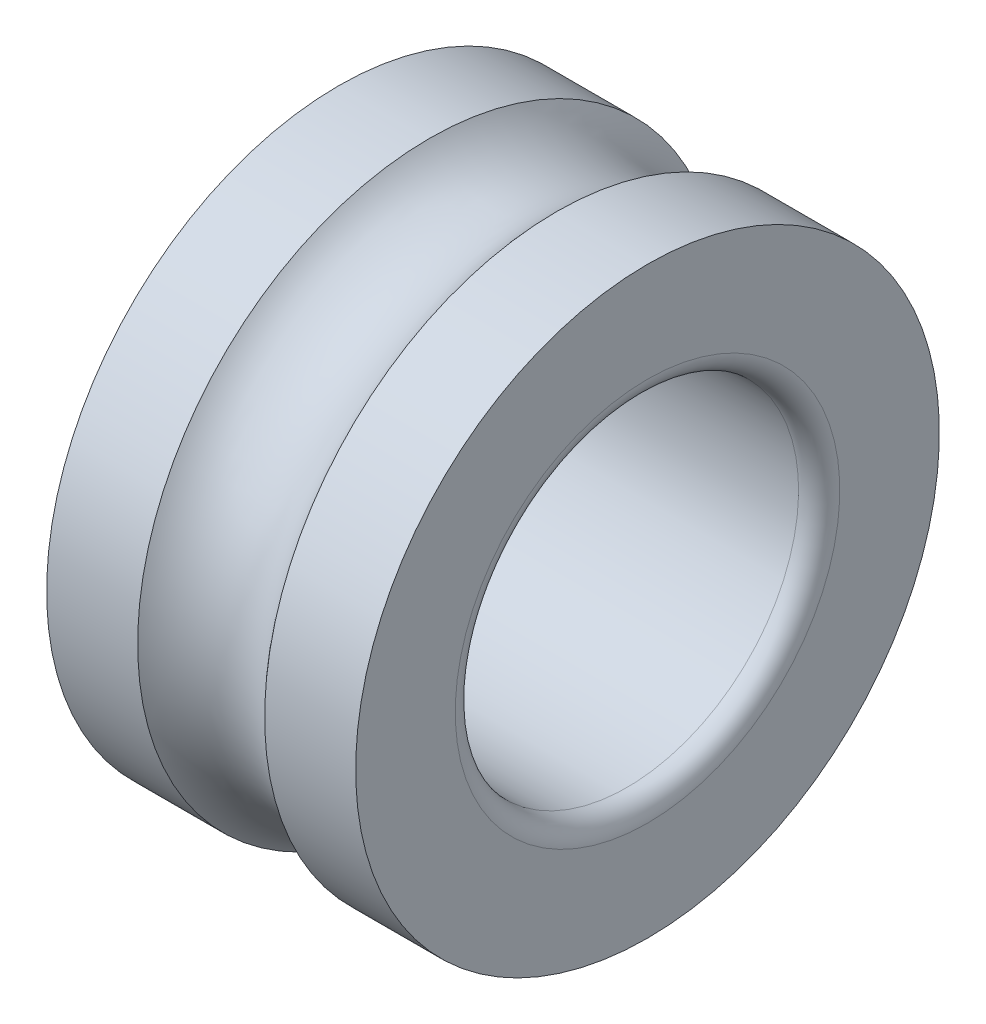
ISO-10303-21;
HEADER;
FILE_DESCRIPTION(('STEP AP214'),'2;1');
FILE_NAME('part.step','',(''),(''),'','','');
FILE_SCHEMA(('AUTOMOTIVE_DESIGN { 1 0 10303 214 1 1 1 1 }'));
ENDSEC;
DATA;
#1=APPLICATION_CONTEXT('core data for automotive mechanical design processes');
#2=APPLICATION_PROTOCOL_DEFINITION('international standard','automotive_design',2000,#1);
#3=PRODUCT_CONTEXT('',#1,'mechanical');
#4=PRODUCT('Part','Part','',(#3));
#5=PRODUCT_RELATED_PRODUCT_CATEGORY('part','',(#4));
#6=PRODUCT_DEFINITION_FORMATION('','',#4);
#7=PRODUCT_DEFINITION_CONTEXT('part definition',#1,'design');
#8=PRODUCT_DEFINITION('design','',#6,#7);
#9=PRODUCT_DEFINITION_SHAPE('','',#8);
#10=(LENGTH_UNIT() NAMED_UNIT(*) SI_UNIT(.MILLI.,.METRE.));
#11=(NAMED_UNIT(*) PLANE_ANGLE_UNIT() SI_UNIT($,.RADIAN.));
#12=(NAMED_UNIT(*) SI_UNIT($,.STERADIAN.) SOLID_ANGLE_UNIT());
#13=UNCERTAINTY_MEASURE_WITH_UNIT(LENGTH_MEASURE(1.E-05),#10,'distance_accuracy_value','');
#14=(GEOMETRIC_REPRESENTATION_CONTEXT(3) GLOBAL_UNCERTAINTY_ASSIGNED_CONTEXT((#13)) GLOBAL_UNIT_ASSIGNED_CONTEXT((#10,
#11,#12)) REPRESENTATION_CONTEXT('',''));
#15=CARTESIAN_POINT('',(0.,0.,0.));
#16=DIRECTION('',(0.,0.,1.));
#17=DIRECTION('',(1.,0.,0.));
#18=AXIS2_PLACEMENT_3D('',#15,#16,#17);
#19=CARTESIAN_POINT('',(8.4,0.,0.));
#20=DIRECTION('',(1.,0.,0.));
#21=DIRECTION('',(0.,0.,-1.));
#22=AXIS2_PLACEMENT_3D('',#19,#20,#21);
#23=TOROIDAL_SURFACE('',#22,5.6,0.6);
#24=CARTESIAN_POINT('',(9.,0.,0.));
#25=DIRECTION('',(1.,0.,0.));
#26=DIRECTION('',(0.,1.,0.));
#27=AXIS2_PLACEMENT_3D('',#24,#25,#26);
#28=CIRCLE('',#27,5.6);
#29=CARTESIAN_POINT('',(9.,5.6,0.));
#30=VERTEX_POINT('',#29);
#31=EDGE_CURVE('E11',#30,#30,#28,.T.);
#32=ORIENTED_EDGE('',*,*,#31,.T.);
#33=EDGE_LOOP('',(#32));
#34=FACE_BOUND('',#33,.T.);
#35=CARTESIAN_POINT('',(8.4,0.,0.));
#36=DIRECTION('',(1.,0.,0.));
#37=DIRECTION('',(0.,1.,0.));
#38=AXIS2_PLACEMENT_3D('',#35,#36,#37);
#39=CIRCLE('',#38,5.);
#40=CARTESIAN_POINT('',(8.4,5.,0.));
#41=VERTEX_POINT('',#40);
#42=EDGE_CURVE('E87',#41,#41,#39,.T.);
#43=ORIENTED_EDGE('',*,*,#42,.F.);
#44=EDGE_LOOP('',(#43));
#45=FACE_BOUND('',#44,.T.);
#46=ADVANCED_FACE('F43',(#34,#45),#23,.T.);
#47=CARTESIAN_POINT('',(9.,7.05,0.));
#48=DIRECTION('',(1.,0.,0.));
#49=DIRECTION('',(0.,1.,0.));
#50=AXIS2_PLACEMENT_3D('',#47,#48,#49);
#51=PLANE('',#50);
#52=CARTESIAN_POINT('',(9.,0.,0.));
#53=DIRECTION('',(1.,0.,0.));
#54=DIRECTION('',(0.,1.,0.));
#55=AXIS2_PLACEMENT_3D('',#52,#53,#54);
#56=CIRCLE('',#55,8.5);
#57=CARTESIAN_POINT('',(9.,8.5,0.));
#58=VERTEX_POINT('',#57);
#59=EDGE_CURVE('E52',#58,#58,#56,.T.);
#60=ORIENTED_EDGE('',*,*,#59,.T.);
#61=EDGE_LOOP('',(#60));
#62=FACE_BOUND('',#61,.T.);
#63=ORIENTED_EDGE('',*,*,#31,.F.);
#64=EDGE_LOOP('',(#63));
#65=FACE_BOUND('',#64,.T.);
#66=ADVANCED_FACE('F44',(#62,#65),#51,.T.);
#67=CARTESIAN_POINT('',(4.5,0.,0.));
#68=DIRECTION('',(-1.,0.,0.));
#69=DIRECTION('',(0.,1.,0.));
#70=AXIS2_PLACEMENT_3D('',#67,#68,#69);
#71=CYLINDRICAL_SURFACE('',#70,8.5);
#72=ORIENTED_EDGE('',*,*,#59,.F.);
#73=EDGE_LOOP('',(#72));
#74=FACE_BOUND('',#73,.T.);
#75=CARTESIAN_POINT('',(6.34909734735627,0.,0.));
#76=DIRECTION('',(1.,0.,0.));
#77=DIRECTION('',(0.,1.,0.));
#78=AXIS2_PLACEMENT_3D('',#75,#76,#77);
#79=CIRCLE('',#78,8.5);
#80=CARTESIAN_POINT('',(6.34909734735627,-8.5,0.));
#81=VERTEX_POINT('',#80);
#82=EDGE_CURVE('E80',#81,#81,#79,.T.);
#83=ORIENTED_EDGE('',*,*,#82,.T.);
#84=EDGE_LOOP('',(#83));
#85=FACE_BOUND('',#84,.T.);
#86=ADVANCED_FACE('F99',(#74,#85),#71,.T.);
#87=CARTESIAN_POINT('',(0.,7.05,0.));
#88=DIRECTION('',(-1.,0.,0.));
#89=DIRECTION('',(0.,-1.,0.));
#90=AXIS2_PLACEMENT_3D('',#87,#88,#89);
#91=PLANE('',#90);
#92=CARTESIAN_POINT('',(0.,0.,0.));
#93=DIRECTION('',(1.,0.,0.));
#94=DIRECTION('',(0.,1.,0.));
#95=AXIS2_PLACEMENT_3D('',#92,#93,#94);
#96=CIRCLE('',#95,5.6);
#97=CARTESIAN_POINT('',(0.,5.6,0.));
#98=VERTEX_POINT('',#97);
#99=EDGE_CURVE('E86',#98,#98,#96,.T.);
#100=ORIENTED_EDGE('',*,*,#99,.T.);
#101=EDGE_LOOP('',(#100));
#102=FACE_BOUND('',#101,.T.);
#103=CARTESIAN_POINT('',(0.,0.,0.));
#104=DIRECTION('',(1.,0.,0.));
#105=DIRECTION('',(0.,1.,0.));
#106=AXIS2_PLACEMENT_3D('',#103,#104,#105);
#107=CIRCLE('',#106,8.5);
#108=CARTESIAN_POINT('',(0.,8.5,0.));
#109=VERTEX_POINT('',#108);
#110=EDGE_CURVE('E76',#109,#109,#107,.T.);
#111=ORIENTED_EDGE('',*,*,#110,.F.);
#112=EDGE_LOOP('',(#111));
#113=FACE_BOUND('',#112,.T.);
#114=ADVANCED_FACE('F105',(#102,#113),#91,.T.);
#115=CARTESIAN_POINT('',(0.6,0.,0.));
#116=DIRECTION('',(1.,0.,0.));
#117=DIRECTION('',(0.,0.,-1.));
#118=AXIS2_PLACEMENT_3D('',#115,#116,#117);
#119=TOROIDAL_SURFACE('',#118,5.6,0.6);
#120=CARTESIAN_POINT('',(0.6,0.,0.));
#121=DIRECTION('',(1.,0.,0.));
#122=DIRECTION('',(0.,1.,0.));
#123=AXIS2_PLACEMENT_3D('',#120,#121,#122);
#124=CIRCLE('',#123,5.);
#125=CARTESIAN_POINT('',(0.6,5.,0.));
#126=VERTEX_POINT('',#125);
#127=EDGE_CURVE('E79',#126,#126,#124,.T.);
#128=ORIENTED_EDGE('',*,*,#127,.T.);
#129=EDGE_LOOP('',(#128));
#130=FACE_BOUND('',#129,.T.);
#131=ORIENTED_EDGE('',*,*,#99,.F.);
#132=EDGE_LOOP('',(#131));
#133=FACE_BOUND('',#132,.T.);
#134=ADVANCED_FACE('F110',(#130,#133),#119,.T.);
#135=CARTESIAN_POINT('',(4.5,0.,0.));
#136=DIRECTION('',(-1.,0.,0.));
#137=DIRECTION('',(0.,1.,0.));
#138=AXIS2_PLACEMENT_3D('',#135,#136,#137);
#139=CYLINDRICAL_SURFACE('',#138,5.);
#140=ORIENTED_EDGE('',*,*,#42,.T.);
#141=EDGE_LOOP('',(#140));
#142=FACE_BOUND('',#141,.T.);
#143=ORIENTED_EDGE('',*,*,#127,.F.);
#144=EDGE_LOOP('',(#143));
#145=FACE_BOUND('',#144,.T.);
#146=ADVANCED_FACE('F122',(#142,#145),#139,.F.);
#147=CARTESIAN_POINT('',(4.5,0.,0.));
#148=DIRECTION('',(-1.,0.,0.));
#149=DIRECTION('',(0.,1.,0.));
#150=AXIS2_PLACEMENT_3D('',#147,#148,#149);
#151=CYLINDRICAL_SURFACE('',#150,8.5);
#152=ORIENTED_EDGE('',*,*,#110,.T.);
#153=EDGE_LOOP('',(#152));
#154=FACE_BOUND('',#153,.T.);
#155=CARTESIAN_POINT('',(2.65090265264373,0.,0.));
#156=DIRECTION('',(-1.,0.,0.));
#157=DIRECTION('',(0.,1.,0.));
#158=AXIS2_PLACEMENT_3D('',#155,#156,#157);
#159=CIRCLE('',#158,8.5);
#160=CARTESIAN_POINT('',(2.65090265264373,-8.5,0.));
#161=VERTEX_POINT('',#160);
#162=EDGE_CURVE('E50',#161,#161,#159,.T.);
#163=ORIENTED_EDGE('',*,*,#162,.T.);
#164=EDGE_LOOP('',(#163));
#165=FACE_BOUND('',#164,.T.);
#166=ADVANCED_FACE('F78',(#154,#165),#151,.T.);
#167=CARTESIAN_POINT('',(4.5,0.,0.));
#168=DIRECTION('',(1.,0.,0.));
#169=DIRECTION('',(0.,0.,-1.));
#170=AXIS2_PLACEMENT_3D('',#167,#168,#169);
#171=TOROIDAL_SURFACE('',#170,10.,2.381);
#172=ORIENTED_EDGE('',*,*,#162,.F.);
#173=EDGE_LOOP('',(#172));
#174=FACE_BOUND('',#173,.T.);
#175=ORIENTED_EDGE('',*,*,#82,.F.);
#176=EDGE_LOOP('',(#175));
#177=FACE_BOUND('',#176,.T.);
#178=ADVANCED_FACE('F119',(#174,#177),#171,.F.);
#179=CLOSED_SHELL('',(#46,#66,#86,#114,#134,#146,#166,#178));
#180=MANIFOLD_SOLID_BREP('B2',#179);
#181=ADVANCED_BREP_SHAPE_REPRESENTATION('',(#18,#180),#14);
#182=SHAPE_DEFINITION_REPRESENTATION(#9,#181);
ENDSEC;
END-ISO-10303-21;
